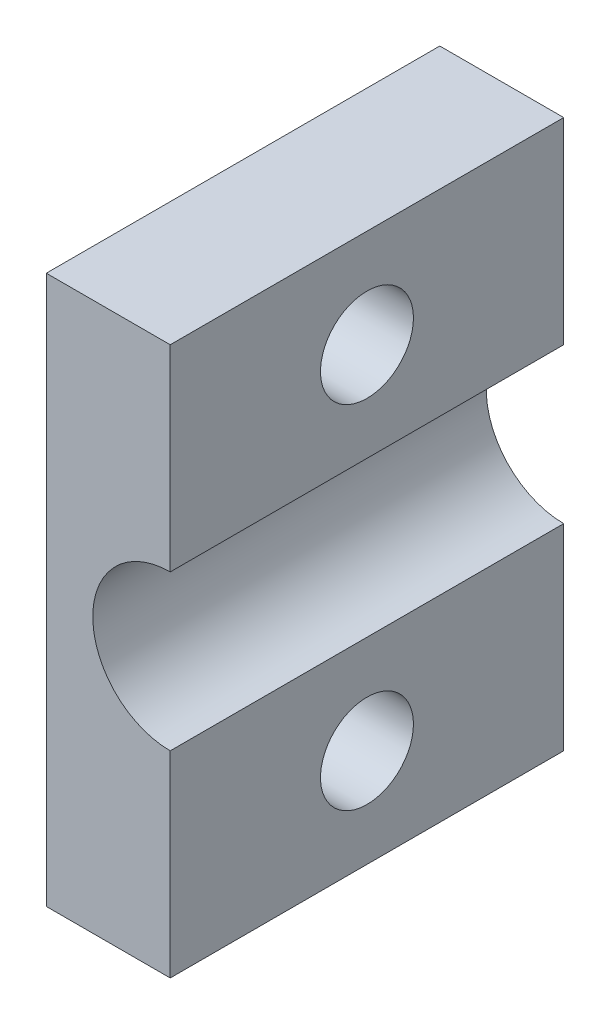
ISO-10303-21;
HEADER;
FILE_DESCRIPTION(('STEP AP214'),'2;1');
FILE_NAME('part.step','',(''),(''),'','','');
FILE_SCHEMA(('AUTOMOTIVE_DESIGN { 1 0 10303 214 1 1 1 1 }'));
ENDSEC;
DATA;
#1=APPLICATION_CONTEXT('core data for automotive mechanical design processes');
#2=APPLICATION_PROTOCOL_DEFINITION('international standard','automotive_design',2000,#1);
#3=PRODUCT_CONTEXT('',#1,'mechanical');
#4=PRODUCT('Part','Part','',(#3));
#5=PRODUCT_RELATED_PRODUCT_CATEGORY('part','',(#4));
#6=PRODUCT_DEFINITION_FORMATION('','',#4);
#7=PRODUCT_DEFINITION_CONTEXT('part definition',#1,'design');
#8=PRODUCT_DEFINITION('design','',#6,#7);
#9=PRODUCT_DEFINITION_SHAPE('','',#8);
#10=(LENGTH_UNIT() NAMED_UNIT(*) SI_UNIT(.MILLI.,.METRE.));
#11=(NAMED_UNIT(*) PLANE_ANGLE_UNIT() SI_UNIT($,.RADIAN.));
#12=(NAMED_UNIT(*) SI_UNIT($,.STERADIAN.) SOLID_ANGLE_UNIT());
#13=UNCERTAINTY_MEASURE_WITH_UNIT(LENGTH_MEASURE(1.E-05),#10,'distance_accuracy_value','');
#14=(GEOMETRIC_REPRESENTATION_CONTEXT(3) GLOBAL_UNCERTAINTY_ASSIGNED_CONTEXT((#13)) GLOBAL_UNIT_ASSIGNED_CONTEXT((#10,
#11,#12)) REPRESENTATION_CONTEXT('',''));
#15=CARTESIAN_POINT('',(0.,0.,0.));
#16=DIRECTION('',(0.,0.,1.));
#17=DIRECTION('',(1.,0.,0.));
#18=AXIS2_PLACEMENT_3D('',#15,#16,#17);
#19=CARTESIAN_POINT('',(0.,8.85,-12.7));
#20=DIRECTION('',(-1.,0.,0.));
#21=DIRECTION('',(0.,0.,1.));
#22=AXIS2_PLACEMENT_3D('',#19,#20,#21);
#23=PLANE('',#22);
#24=CARTESIAN_POINT('',(0.,-5.675,-6.35));
#25=DIRECTION('',(1.,0.,0.));
#26=DIRECTION('',(0.,0.,-1.));
#27=AXIS2_PLACEMENT_3D('',#24,#25,#26);
#28=CIRCLE('',#27,1.5);
#29=CARTESIAN_POINT('',(0.,-5.675,-7.85));
#30=VERTEX_POINT('',#29);
#31=EDGE_CURVE('E202',#30,#30,#28,.T.);
#32=ORIENTED_EDGE('',*,*,#31,.F.);
#33=EDGE_LOOP('',(#32));
#34=FACE_BOUND('',#33,.T.);
#35=DIRECTION('',(0.,-1.,0.));
#36=VECTOR('',#35,1.);
#37=CARTESIAN_POINT('',(0.,8.85,-12.7));
#38=LINE('',#37,#36);
#39=CARTESIAN_POINT('',(0.,-2.5,-12.7));
#40=VERTEX_POINT('',#39);
#41=CARTESIAN_POINT('',(0.,-8.85,-12.7));
#42=VERTEX_POINT('',#41);
#43=EDGE_CURVE('E91',#40,#42,#38,.T.);
#44=ORIENTED_EDGE('',*,*,#43,.F.);
#45=DIRECTION('',(0.,0.,1.));
#46=VECTOR('',#45,1.);
#47=CARTESIAN_POINT('',(0.,-2.5,-12.7));
#48=LINE('',#47,#46);
#49=CARTESIAN_POINT('',(0.,-2.5,0.));
#50=VERTEX_POINT('',#49);
#51=EDGE_CURVE('E11',#40,#50,#48,.T.);
#52=ORIENTED_EDGE('',*,*,#51,.T.);
#53=DIRECTION('',(0.,-1.,0.));
#54=VECTOR('',#53,1.);
#55=CARTESIAN_POINT('',(0.,8.85,0.));
#56=LINE('',#55,#54);
#57=CARTESIAN_POINT('',(0.,-8.85,0.));
#58=VERTEX_POINT('',#57);
#59=EDGE_CURVE('E121',#50,#58,#56,.T.);
#60=ORIENTED_EDGE('',*,*,#59,.T.);
#61=DIRECTION('',(0.,0.,-1.));
#62=VECTOR('',#61,1.);
#63=CARTESIAN_POINT('',(0.,-8.85,-12.7));
#64=LINE('',#63,#62);
#65=EDGE_CURVE('E157',#58,#42,#64,.T.);
#66=ORIENTED_EDGE('',*,*,#65,.T.);
#67=EDGE_LOOP('',(#44,#52,#60,#66));
#68=FACE_BOUND('',#67,.T.);
#69=ADVANCED_FACE('F45',(#34,#68),#23,.F.);
#70=CARTESIAN_POINT('',(-4.,8.85,-12.7));
#71=DIRECTION('',(0.,0.,1.));
#72=DIRECTION('',(1.,0.,0.));
#73=AXIS2_PLACEMENT_3D('',#70,#71,#72);
#74=PLANE('',#73);
#75=CARTESIAN_POINT('',(0.,8.85,-12.7));
#76=VERTEX_POINT('',#75);
#77=CARTESIAN_POINT('',(0.,2.5,-12.7));
#78=VERTEX_POINT('',#77);
#79=EDGE_CURVE('E133',#76,#78,#38,.T.);
#80=ORIENTED_EDGE('',*,*,#79,.T.);
#81=CARTESIAN_POINT('',(0.,0.,-12.7));
#82=DIRECTION('',(0.,0.,1.));
#83=DIRECTION('',(1.,0.,0.));
#84=AXIS2_PLACEMENT_3D('',#81,#82,#83);
#85=CIRCLE('',#84,2.5);
#86=EDGE_CURVE('E61',#78,#40,#85,.T.);
#87=ORIENTED_EDGE('',*,*,#86,.T.);
#88=ORIENTED_EDGE('',*,*,#43,.T.);
#89=DIRECTION('',(-1.,0.,0.));
#90=VECTOR('',#89,1.);
#91=CARTESIAN_POINT('',(-4.,-8.85,-12.7));
#92=LINE('',#91,#90);
#93=CARTESIAN_POINT('',(-4.,-8.85,-12.7));
#94=VERTEX_POINT('',#93);
#95=EDGE_CURVE('E143',#42,#94,#92,.T.);
#96=ORIENTED_EDGE('',*,*,#95,.T.);
#97=DIRECTION('',(0.,-1.,0.));
#98=VECTOR('',#97,1.);
#99=CARTESIAN_POINT('',(-4.,8.85,-12.7));
#100=LINE('',#99,#98);
#101=CARTESIAN_POINT('',(-4.,8.85,-12.7));
#102=VERTEX_POINT('',#101);
#103=EDGE_CURVE('E113',#102,#94,#100,.T.);
#104=ORIENTED_EDGE('',*,*,#103,.F.);
#105=DIRECTION('',(-1.,0.,0.));
#106=VECTOR('',#105,1.);
#107=CARTESIAN_POINT('',(-4.,8.85,-12.7));
#108=LINE('',#107,#106);
#109=EDGE_CURVE('E159',#76,#102,#108,.T.);
#110=ORIENTED_EDGE('',*,*,#109,.F.);
#111=EDGE_LOOP('',(#80,#87,#88,#96,#104,#110));
#112=FACE_BOUND('',#111,.T.);
#113=ADVANCED_FACE('F47',(#112),#74,.F.);
#114=CARTESIAN_POINT('',(-4.,8.85,0.));
#115=DIRECTION('',(1.,0.,0.));
#116=DIRECTION('',(0.,0.,-1.));
#117=AXIS2_PLACEMENT_3D('',#114,#115,#116);
#118=PLANE('',#117);
#119=CARTESIAN_POINT('',(-4.,5.675,-6.35));
#120=DIRECTION('',(1.,0.,0.));
#121=DIRECTION('',(0.,0.,-1.));
#122=AXIS2_PLACEMENT_3D('',#119,#120,#121);
#123=CIRCLE('',#122,1.5);
#124=CARTESIAN_POINT('',(-4.,5.675,-7.85));
#125=VERTEX_POINT('',#124);
#126=EDGE_CURVE('E123',#125,#125,#123,.T.);
#127=ORIENTED_EDGE('',*,*,#126,.T.);
#128=EDGE_LOOP('',(#127));
#129=FACE_BOUND('',#128,.T.);
#130=CARTESIAN_POINT('',(-4.,-5.675,-6.35));
#131=DIRECTION('',(1.,0.,0.));
#132=DIRECTION('',(0.,0.,-1.));
#133=AXIS2_PLACEMENT_3D('',#130,#131,#132);
#134=CIRCLE('',#133,1.5);
#135=CARTESIAN_POINT('',(-4.,-5.675,-7.85));
#136=VERTEX_POINT('',#135);
#137=EDGE_CURVE('E209',#136,#136,#134,.T.);
#138=ORIENTED_EDGE('',*,*,#137,.T.);
#139=EDGE_LOOP('',(#138));
#140=FACE_BOUND('',#139,.T.);
#141=DIRECTION('',(0.,0.,1.));
#142=VECTOR('',#141,1.);
#143=CARTESIAN_POINT('',(-4.,-8.85,0.));
#144=LINE('',#143,#142);
#145=CARTESIAN_POINT('',(-4.,-8.85,0.));
#146=VERTEX_POINT('',#145);
#147=EDGE_CURVE('E140',#94,#146,#144,.T.);
#148=ORIENTED_EDGE('',*,*,#147,.T.);
#149=DIRECTION('',(0.,-1.,0.));
#150=VECTOR('',#149,1.);
#151=CARTESIAN_POINT('',(-4.,8.85,0.));
#152=LINE('',#151,#150);
#153=CARTESIAN_POINT('',(-4.,8.85,0.));
#154=VERTEX_POINT('',#153);
#155=EDGE_CURVE('E127',#154,#146,#152,.T.);
#156=ORIENTED_EDGE('',*,*,#155,.F.);
#157=DIRECTION('',(0.,0.,1.));
#158=VECTOR('',#157,1.);
#159=CARTESIAN_POINT('',(-4.,8.85,0.));
#160=LINE('',#159,#158);
#161=EDGE_CURVE('E99',#102,#154,#160,.T.);
#162=ORIENTED_EDGE('',*,*,#161,.F.);
#163=ORIENTED_EDGE('',*,*,#103,.T.);
#164=EDGE_LOOP('',(#148,#156,#162,#163));
#165=FACE_BOUND('',#164,.T.);
#166=ADVANCED_FACE('F139',(#129,#140,#165),#118,.F.);
#167=CARTESIAN_POINT('',(0.,8.85,0.));
#168=DIRECTION('',(0.,0.,-1.));
#169=DIRECTION('',(-1.,0.,0.));
#170=AXIS2_PLACEMENT_3D('',#167,#168,#169);
#171=PLANE('',#170);
#172=ORIENTED_EDGE('',*,*,#59,.F.);
#173=CARTESIAN_POINT('',(0.,0.,0.));
#174=DIRECTION('',(0.,0.,1.));
#175=DIRECTION('',(1.,0.,0.));
#176=AXIS2_PLACEMENT_3D('',#173,#174,#175);
#177=CIRCLE('',#176,2.5);
#178=CARTESIAN_POINT('',(0.,2.5,0.));
#179=VERTEX_POINT('',#178);
#180=EDGE_CURVE('E108',#179,#50,#177,.T.);
#181=ORIENTED_EDGE('',*,*,#180,.F.);
#182=CARTESIAN_POINT('',(0.,8.85,0.));
#183=VERTEX_POINT('',#182);
#184=EDGE_CURVE('E119',#183,#179,#56,.T.);
#185=ORIENTED_EDGE('',*,*,#184,.F.);
#186=DIRECTION('',(1.,0.,0.));
#187=VECTOR('',#186,1.);
#188=CARTESIAN_POINT('',(0.,8.85,0.));
#189=LINE('',#188,#187);
#190=EDGE_CURVE('E164',#154,#183,#189,.T.);
#191=ORIENTED_EDGE('',*,*,#190,.F.);
#192=ORIENTED_EDGE('',*,*,#155,.T.);
#193=DIRECTION('',(1.,0.,0.));
#194=VECTOR('',#193,1.);
#195=CARTESIAN_POINT('',(0.,-8.85,0.));
#196=LINE('',#195,#194);
#197=EDGE_CURVE('E150',#146,#58,#196,.T.);
#198=ORIENTED_EDGE('',*,*,#197,.T.);
#199=EDGE_LOOP('',(#172,#181,#185,#191,#192,#198));
#200=FACE_BOUND('',#199,.T.);
#201=ADVANCED_FACE('F117',(#200),#171,.F.);
#202=CARTESIAN_POINT('',(0.,5.675,-6.35));
#203=DIRECTION('',(1.,0.,0.));
#204=DIRECTION('',(0.,0.,-1.));
#205=AXIS2_PLACEMENT_3D('',#202,#203,#204);
#206=CIRCLE('',#205,1.5);
#207=CARTESIAN_POINT('',(0.,5.675,-7.85));
#208=VERTEX_POINT('',#207);
#209=EDGE_CURVE('E199',#208,#208,#206,.T.);
#210=ORIENTED_EDGE('',*,*,#209,.F.);
#211=EDGE_LOOP('',(#210));
#212=FACE_BOUND('',#211,.T.);
#213=ORIENTED_EDGE('',*,*,#184,.T.);
#214=DIRECTION('',(0.,0.,1.));
#215=VECTOR('',#214,1.);
#216=CARTESIAN_POINT('',(0.,2.5,-12.7));
#217=LINE('',#216,#215);
#218=EDGE_CURVE('E54',#179,#78,#217,.F.);
#219=ORIENTED_EDGE('',*,*,#218,.T.);
#220=ORIENTED_EDGE('',*,*,#79,.F.);
#221=DIRECTION('',(0.,0.,-1.));
#222=VECTOR('',#221,1.);
#223=CARTESIAN_POINT('',(0.,8.85,-12.7));
#224=LINE('',#223,#222);
#225=EDGE_CURVE('E70',#183,#76,#224,.T.);
#226=ORIENTED_EDGE('',*,*,#225,.F.);
#227=EDGE_LOOP('',(#213,#219,#220,#226));
#228=FACE_BOUND('',#227,.T.);
#229=ADVANCED_FACE('F125',(#212,#228),#23,.F.);
#230=CARTESIAN_POINT('',(0.,8.85,0.));
#231=DIRECTION('',(0.,-1.,0.));
#232=DIRECTION('',(0.,0.,-1.));
#233=AXIS2_PLACEMENT_3D('',#230,#231,#232);
#234=PLANE('',#233);
#235=ORIENTED_EDGE('',*,*,#109,.T.);
#236=ORIENTED_EDGE('',*,*,#161,.T.);
#237=ORIENTED_EDGE('',*,*,#190,.T.);
#238=ORIENTED_EDGE('',*,*,#225,.T.);
#239=EDGE_LOOP('',(#235,#236,#237,#238));
#240=FACE_BOUND('',#239,.T.);
#241=ADVANCED_FACE('F173',(#240),#234,.F.);
#242=CARTESIAN_POINT('',(0.,-8.85,0.));
#243=DIRECTION('',(0.,-1.,0.));
#244=DIRECTION('',(0.,0.,-1.));
#245=AXIS2_PLACEMENT_3D('',#242,#243,#244);
#246=PLANE('',#245);
#247=ORIENTED_EDGE('',*,*,#95,.F.);
#248=ORIENTED_EDGE('',*,*,#65,.F.);
#249=ORIENTED_EDGE('',*,*,#197,.F.);
#250=ORIENTED_EDGE('',*,*,#147,.F.);
#251=EDGE_LOOP('',(#247,#248,#249,#250));
#252=FACE_BOUND('',#251,.T.);
#253=ADVANCED_FACE('F171',(#252),#246,.T.);
#254=CARTESIAN_POINT('',(0.,0.,-12.7));
#255=DIRECTION('',(0.,0.,1.));
#256=DIRECTION('',(1.,0.,0.));
#257=AXIS2_PLACEMENT_3D('',#254,#255,#256);
#258=CYLINDRICAL_SURFACE('',#257,2.5);
#259=ORIENTED_EDGE('',*,*,#86,.F.);
#260=ORIENTED_EDGE('',*,*,#218,.F.);
#261=ORIENTED_EDGE('',*,*,#180,.T.);
#262=ORIENTED_EDGE('',*,*,#51,.F.);
#263=EDGE_LOOP('',(#259,#260,#261,#262));
#264=FACE_BOUND('',#263,.T.);
#265=ADVANCED_FACE('F107',(#264),#258,.F.);
#266=CARTESIAN_POINT('',(-4.,5.675,-6.35));
#267=DIRECTION('',(1.,0.,0.));
#268=DIRECTION('',(0.,0.,-1.));
#269=AXIS2_PLACEMENT_3D('',#266,#267,#268);
#270=CYLINDRICAL_SURFACE('',#269,1.5);
#271=ORIENTED_EDGE('',*,*,#126,.F.);
#272=EDGE_LOOP('',(#271));
#273=FACE_BOUND('',#272,.T.);
#274=ORIENTED_EDGE('',*,*,#209,.T.);
#275=EDGE_LOOP('',(#274));
#276=FACE_BOUND('',#275,.T.);
#277=ADVANCED_FACE('F180',(#273,#276),#270,.F.);
#278=CARTESIAN_POINT('',(-4.,-5.675,-6.35));
#279=DIRECTION('',(1.,0.,0.));
#280=DIRECTION('',(0.,0.,-1.));
#281=AXIS2_PLACEMENT_3D('',#278,#279,#280);
#282=CYLINDRICAL_SURFACE('',#281,1.5);
#283=ORIENTED_EDGE('',*,*,#137,.F.);
#284=EDGE_LOOP('',(#283));
#285=FACE_BOUND('',#284,.T.);
#286=ORIENTED_EDGE('',*,*,#31,.T.);
#287=EDGE_LOOP('',(#286));
#288=FACE_BOUND('',#287,.T.);
#289=ADVANCED_FACE('F217',(#285,#288),#282,.F.);
#290=CLOSED_SHELL('',(#69,#113,#166,#201,#229,#241,#253,#265,#277,#289));
#291=MANIFOLD_SOLID_BREP('B2',#290);
#292=ADVANCED_BREP_SHAPE_REPRESENTATION('',(#18,#291),#14);
#293=SHAPE_DEFINITION_REPRESENTATION(#9,#292);
ENDSEC;
END-ISO-10303-21;
